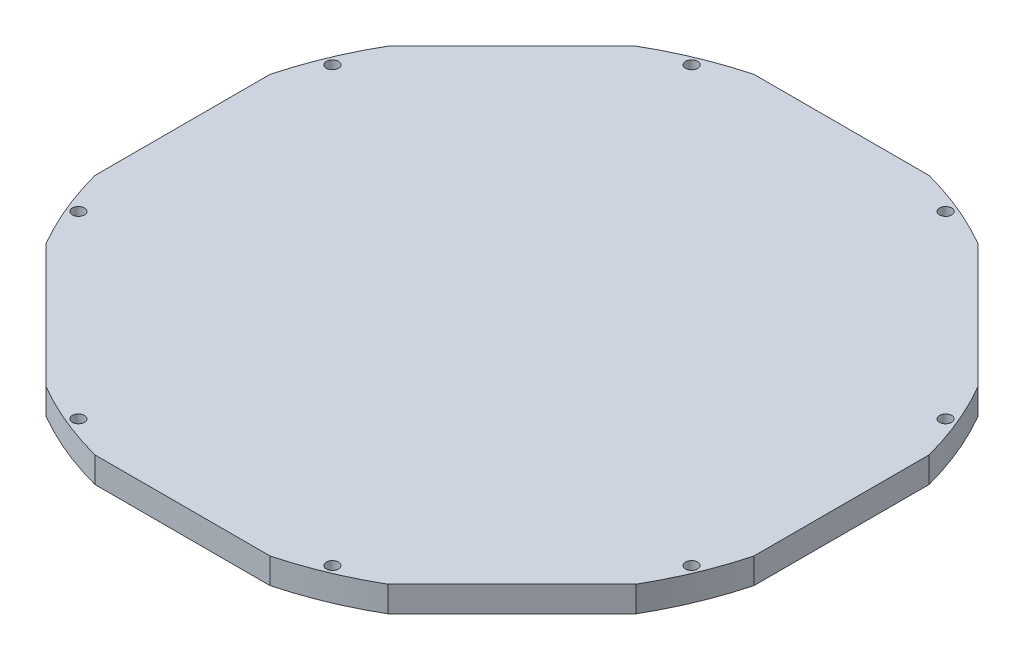
ISO-10303-21;
HEADER;
FILE_DESCRIPTION(('STEP AP214'),'2;1');
FILE_NAME('part.step','',(''),(''),'','','');
FILE_SCHEMA(('AUTOMOTIVE_DESIGN { 1 0 10303 214 1 1 1 1 }'));
ENDSEC;
DATA;
#1=APPLICATION_CONTEXT('core data for automotive mechanical design processes');
#2=APPLICATION_PROTOCOL_DEFINITION('international standard','automotive_design',2000,#1);
#3=PRODUCT_CONTEXT('',#1,'mechanical');
#4=PRODUCT('Part','Part','',(#3));
#5=PRODUCT_RELATED_PRODUCT_CATEGORY('part','',(#4));
#6=PRODUCT_DEFINITION_FORMATION('','',#4);
#7=PRODUCT_DEFINITION_CONTEXT('part definition',#1,'design');
#8=PRODUCT_DEFINITION('design','',#6,#7);
#9=PRODUCT_DEFINITION_SHAPE('','',#8);
#10=(LENGTH_UNIT() NAMED_UNIT(*) SI_UNIT(.MILLI.,.METRE.));
#11=(NAMED_UNIT(*) PLANE_ANGLE_UNIT() SI_UNIT($,.RADIAN.));
#12=(NAMED_UNIT(*) SI_UNIT($,.STERADIAN.) SOLID_ANGLE_UNIT());
#13=UNCERTAINTY_MEASURE_WITH_UNIT(LENGTH_MEASURE(1.E-05),#10,'distance_accuracy_value','');
#14=(GEOMETRIC_REPRESENTATION_CONTEXT(3) GLOBAL_UNCERTAINTY_ASSIGNED_CONTEXT((#13)) GLOBAL_UNIT_ASSIGNED_CONTEXT((#10,
#11,#12)) REPRESENTATION_CONTEXT('',''));
#15=CARTESIAN_POINT('',(0.,0.,0.));
#16=DIRECTION('',(0.,0.,1.));
#17=DIRECTION('',(1.,0.,0.));
#18=AXIS2_PLACEMENT_3D('',#15,#16,#17);
#19=CARTESIAN_POINT('',(0.,9.525,122.123199999997));
#20=DIRECTION('',(0.,0.,1.));
#21=DIRECTION('',(1.,0.,0.));
#22=AXIS2_PLACEMENT_3D('',#19,#20,#21);
#23=PLANE('',#22);
#24=DIRECTION('',(-1.,0.,0.));
#25=VECTOR('',#24,1.);
#26=CARTESIAN_POINT('',(0.,0.,122.123199999997));
#27=LINE('',#26,#25);
#28=CARTESIAN_POINT('',(32.4659397948168,0.,122.123199999997));
#29=VERTEX_POINT('',#28);
#30=CARTESIAN_POINT('',(-32.4659397947961,0.,122.123199999997));
#31=VERTEX_POINT('',#30);
#32=EDGE_CURVE('E185',#29,#31,#27,.T.);
#33=ORIENTED_EDGE('',*,*,#32,.F.);
#34=DIRECTION('',(0.,-1.,0.));
#35=VECTOR('',#34,1.);
#36=CARTESIAN_POINT('',(32.4659397948168,9.525,122.123199999997));
#37=LINE('',#36,#35);
#38=CARTESIAN_POINT('',(32.4659397948168,9.525,122.123199999997));
#39=VERTEX_POINT('',#38);
#40=EDGE_CURVE('E11',#39,#29,#37,.T.);
#41=ORIENTED_EDGE('',*,*,#40,.F.);
#42=DIRECTION('',(-1.,0.,0.));
#43=VECTOR('',#42,1.);
#44=CARTESIAN_POINT('',(0.,9.525,122.123199999997));
#45=LINE('',#44,#43);
#46=CARTESIAN_POINT('',(-32.4659397947961,9.525,122.123199999997));
#47=VERTEX_POINT('',#46);
#48=EDGE_CURVE('E299',#39,#47,#45,.T.);
#49=ORIENTED_EDGE('',*,*,#48,.T.);
#50=DIRECTION('',(0.,-1.,0.));
#51=VECTOR('',#50,1.);
#52=CARTESIAN_POINT('',(-32.4659397947961,9.525,122.123199999997));
#53=LINE('',#52,#51);
#54=EDGE_CURVE('E92',#47,#31,#53,.T.);
#55=ORIENTED_EDGE('',*,*,#54,.T.);
#56=EDGE_LOOP('',(#33,#41,#49,#55));
#57=FACE_BOUND('',#56,.T.);
#58=ADVANCED_FACE('F17',(#57),#23,.T.);
#59=CARTESIAN_POINT('',(0.,9.525,0.));
#60=DIRECTION('',(0.,-1.,0.));
#61=DIRECTION('',(0.,0.,-1.));
#62=AXIS2_PLACEMENT_3D('',#59,#60,#61);
#63=CYLINDRICAL_SURFACE('',#62,126.365);
#64=CARTESIAN_POINT('',(0.,0.,0.));
#65=DIRECTION('',(0.,1.,0.));
#66=DIRECTION('',(0.,0.,1.));
#67=AXIS2_PLACEMENT_3D('',#64,#65,#66);
#68=CIRCLE('',#67,126.365);
#69=CARTESIAN_POINT('',(63.397256673707,0.,109.311029046697));
#70=VERTEX_POINT('',#69);
#71=EDGE_CURVE('E188',#29,#70,#68,.T.);
#72=ORIENTED_EDGE('',*,*,#71,.T.);
#73=DIRECTION('',(0.,-1.,0.));
#74=VECTOR('',#73,1.);
#75=CARTESIAN_POINT('',(63.397256673707,9.525,109.311029046697));
#76=LINE('',#75,#74);
#77=CARTESIAN_POINT('',(63.397256673707,9.525,109.311029046697));
#78=VERTEX_POINT('',#77);
#79=EDGE_CURVE('E26',#78,#70,#76,.T.);
#80=ORIENTED_EDGE('',*,*,#79,.F.);
#81=CARTESIAN_POINT('',(0.,9.525,0.));
#82=DIRECTION('',(0.,1.,0.));
#83=DIRECTION('',(0.,0.,1.));
#84=AXIS2_PLACEMENT_3D('',#81,#82,#83);
#85=CIRCLE('',#84,126.365);
#86=EDGE_CURVE('E157',#39,#78,#85,.T.);
#87=ORIENTED_EDGE('',*,*,#86,.F.);
#88=ORIENTED_EDGE('',*,*,#40,.T.);
#89=EDGE_LOOP('',(#72,#80,#87,#88));
#90=FACE_BOUND('',#89,.T.);
#91=ADVANCED_FACE('F248',(#90),#63,.T.);
#92=CARTESIAN_POINT('',(86.3541428602019,9.525,86.3541428602019));
#93=DIRECTION('',(0.707106781186548,0.,0.707106781186548));
#94=DIRECTION('',(0.707106781186548,0.,-0.707106781186548));
#95=AXIS2_PLACEMENT_3D('',#92,#93,#94);
#96=PLANE('',#95);
#97=DIRECTION('',(-0.707106781186548,0.,0.707106781186548));
#98=VECTOR('',#97,1.);
#99=CARTESIAN_POINT('',(86.3541428602019,0.,86.3541428602019));
#100=LINE('',#99,#98);
#101=CARTESIAN_POINT('',(109.311029046711,0.,63.3972566736932));
#102=VERTEX_POINT('',#101);
#103=EDGE_CURVE('E191',#102,#70,#100,.T.);
#104=ORIENTED_EDGE('',*,*,#103,.F.);
#105=DIRECTION('',(0.,-1.,0.));
#106=VECTOR('',#105,1.);
#107=CARTESIAN_POINT('',(109.311029046711,9.525,63.3972566736932));
#108=LINE('',#107,#106);
#109=CARTESIAN_POINT('',(109.311029046711,9.525,63.3972566736932));
#110=VERTEX_POINT('',#109);
#111=EDGE_CURVE('E238',#110,#102,#108,.T.);
#112=ORIENTED_EDGE('',*,*,#111,.F.);
#113=DIRECTION('',(-0.707106781186548,0.,0.707106781186548));
#114=VECTOR('',#113,1.);
#115=CARTESIAN_POINT('',(86.3541428602019,9.525,86.3541428602019));
#116=LINE('',#115,#114);
#117=EDGE_CURVE('E245',#110,#78,#116,.T.);
#118=ORIENTED_EDGE('',*,*,#117,.T.);
#119=ORIENTED_EDGE('',*,*,#79,.T.);
#120=EDGE_LOOP('',(#104,#112,#118,#119));
#121=FACE_BOUND('',#120,.T.);
#122=ADVANCED_FACE('F243',(#121),#96,.T.);
#123=CARTESIAN_POINT('',(122.123200000004,0.,32.4659397948));
#124=VERTEX_POINT('',#123);
#125=EDGE_CURVE('E193',#102,#124,#68,.T.);
#126=ORIENTED_EDGE('',*,*,#125,.T.);
#127=DIRECTION('',(0.,-1.,0.));
#128=VECTOR('',#127,1.);
#129=CARTESIAN_POINT('',(122.123200000004,9.525,32.4659397948));
#130=LINE('',#129,#128);
#131=CARTESIAN_POINT('',(122.123200000004,9.525,32.4659397948));
#132=VERTEX_POINT('',#131);
#133=EDGE_CURVE('E236',#132,#124,#130,.T.);
#134=ORIENTED_EDGE('',*,*,#133,.F.);
#135=EDGE_CURVE('E301',#110,#132,#85,.T.);
#136=ORIENTED_EDGE('',*,*,#135,.F.);
#137=ORIENTED_EDGE('',*,*,#111,.T.);
#138=EDGE_LOOP('',(#126,#134,#136,#137));
#139=FACE_BOUND('',#138,.T.);
#140=ADVANCED_FACE('F325',(#139),#63,.T.);
#141=CARTESIAN_POINT('',(122.123200000004,9.525,0.));
#142=DIRECTION('',(1.,0.,0.));
#143=DIRECTION('',(0.,0.,-1.));
#144=AXIS2_PLACEMENT_3D('',#141,#142,#143);
#145=PLANE('',#144);
#146=DIRECTION('',(0.,0.,1.));
#147=VECTOR('',#146,1.);
#148=CARTESIAN_POINT('',(122.123200000004,0.,0.));
#149=LINE('',#148,#147);
#150=CARTESIAN_POINT('',(122.123200000004,0.,-32.465939794813));
#151=VERTEX_POINT('',#150);
#152=EDGE_CURVE('E196',#151,#124,#149,.T.);
#153=ORIENTED_EDGE('',*,*,#152,.F.);
#154=DIRECTION('',(0.,-1.,0.));
#155=VECTOR('',#154,1.);
#156=CARTESIAN_POINT('',(122.123200000004,9.525,-32.465939794813));
#157=LINE('',#156,#155);
#158=CARTESIAN_POINT('',(122.123200000004,9.525,-32.465939794813));
#159=VERTEX_POINT('',#158);
#160=EDGE_CURVE('E234',#159,#151,#157,.T.);
#161=ORIENTED_EDGE('',*,*,#160,.F.);
#162=DIRECTION('',(0.,0.,1.));
#163=VECTOR('',#162,1.);
#164=CARTESIAN_POINT('',(122.123200000004,9.525,0.));
#165=LINE('',#164,#163);
#166=EDGE_CURVE('E303',#159,#132,#165,.T.);
#167=ORIENTED_EDGE('',*,*,#166,.T.);
#168=ORIENTED_EDGE('',*,*,#133,.T.);
#169=EDGE_LOOP('',(#153,#161,#167,#168));
#170=FACE_BOUND('',#169,.T.);
#171=ADVANCED_FACE('F327',(#170),#145,.T.);
#172=CARTESIAN_POINT('',(109.311029046703,0.,-63.3972566737032));
#173=VERTEX_POINT('',#172);
#174=EDGE_CURVE('E199',#151,#173,#68,.T.);
#175=ORIENTED_EDGE('',*,*,#174,.T.);
#176=DIRECTION('',(0.,-1.,0.));
#177=VECTOR('',#176,1.);
#178=CARTESIAN_POINT('',(109.311029046703,9.525,-63.3972566737032));
#179=LINE('',#178,#177);
#180=CARTESIAN_POINT('',(109.311029046703,9.525,-63.3972566737032));
#181=VERTEX_POINT('',#180);
#182=EDGE_CURVE('E232',#181,#173,#179,.T.);
#183=ORIENTED_EDGE('',*,*,#182,.F.);
#184=EDGE_CURVE('E306',#159,#181,#85,.T.);
#185=ORIENTED_EDGE('',*,*,#184,.F.);
#186=ORIENTED_EDGE('',*,*,#160,.T.);
#187=EDGE_LOOP('',(#175,#183,#185,#186));
#188=FACE_BOUND('',#187,.T.);
#189=ADVANCED_FACE('F328',(#188),#63,.T.);
#190=CARTESIAN_POINT('',(86.3541428602033,9.525,-86.3541428602033));
#191=DIRECTION('',(0.707106781186548,0.,-0.707106781186548));
#192=DIRECTION('',(-0.707106781186548,0.,-0.707106781186548));
#193=AXIS2_PLACEMENT_3D('',#190,#191,#192);
#194=PLANE('',#193);
#195=DIRECTION('',(0.707106781186548,0.,0.707106781186548));
#196=VECTOR('',#195,1.);
#197=CARTESIAN_POINT('',(86.3541428602033,0.,-86.3541428602033));
#198=LINE('',#197,#196);
#199=CARTESIAN_POINT('',(63.3972566736997,0.,-109.311029046707));
#200=VERTEX_POINT('',#199);
#201=EDGE_CURVE('E200',#200,#173,#198,.T.);
#202=ORIENTED_EDGE('',*,*,#201,.F.);
#203=DIRECTION('',(0.,-1.,0.));
#204=VECTOR('',#203,1.);
#205=CARTESIAN_POINT('',(63.3972566736997,9.525,-109.311029046707));
#206=LINE('',#205,#204);
#207=CARTESIAN_POINT('',(63.3972566736997,9.525,-109.311029046707));
#208=VERTEX_POINT('',#207);
#209=EDGE_CURVE('E230',#208,#200,#206,.T.);
#210=ORIENTED_EDGE('',*,*,#209,.F.);
#211=DIRECTION('',(0.707106781186548,0.,0.707106781186548));
#212=VECTOR('',#211,1.);
#213=CARTESIAN_POINT('',(86.3541428602033,9.525,-86.3541428602033));
#214=LINE('',#213,#212);
#215=EDGE_CURVE('E307',#208,#181,#214,.T.);
#216=ORIENTED_EDGE('',*,*,#215,.T.);
#217=ORIENTED_EDGE('',*,*,#182,.T.);
#218=EDGE_LOOP('',(#202,#210,#216,#217));
#219=FACE_BOUND('',#218,.T.);
#220=ADVANCED_FACE('F331',(#219),#194,.T.);
#221=CARTESIAN_POINT('',(32.4659397948065,0.,-122.1232));
#222=VERTEX_POINT('',#221);
#223=EDGE_CURVE('E203',#200,#222,#68,.T.);
#224=ORIENTED_EDGE('',*,*,#223,.T.);
#225=DIRECTION('',(0.,-1.,0.));
#226=VECTOR('',#225,1.);
#227=CARTESIAN_POINT('',(32.4659397948065,9.525,-122.1232));
#228=LINE('',#227,#226);
#229=CARTESIAN_POINT('',(32.4659397948065,9.525,-122.1232));
#230=VERTEX_POINT('',#229);
#231=EDGE_CURVE('E228',#230,#222,#228,.T.);
#232=ORIENTED_EDGE('',*,*,#231,.F.);
#233=EDGE_CURVE('E310',#208,#230,#85,.T.);
#234=ORIENTED_EDGE('',*,*,#233,.F.);
#235=ORIENTED_EDGE('',*,*,#209,.T.);
#236=EDGE_LOOP('',(#224,#232,#234,#235));
#237=FACE_BOUND('',#236,.T.);
#238=ADVANCED_FACE('F332',(#237),#63,.T.);
#239=CARTESIAN_POINT('',(0.,9.525,-122.1232));
#240=DIRECTION('',(0.,0.,-1.));
#241=DIRECTION('',(-1.,0.,0.));
#242=AXIS2_PLACEMENT_3D('',#239,#240,#241);
#243=PLANE('',#242);
#244=DIRECTION('',(1.,0.,0.));
#245=VECTOR('',#244,1.);
#246=CARTESIAN_POINT('',(0.,0.,-122.1232));
#247=LINE('',#246,#245);
#248=CARTESIAN_POINT('',(-32.4659397948065,0.,-122.1232));
#249=VERTEX_POINT('',#248);
#250=EDGE_CURVE('E204',#249,#222,#247,.T.);
#251=ORIENTED_EDGE('',*,*,#250,.F.);
#252=DIRECTION('',(0.,-1.,0.));
#253=VECTOR('',#252,1.);
#254=CARTESIAN_POINT('',(-32.4659397948065,9.525,-122.1232));
#255=LINE('',#254,#253);
#256=CARTESIAN_POINT('',(-32.4659397948065,9.525,-122.1232));
#257=VERTEX_POINT('',#256);
#258=EDGE_CURVE('E226',#257,#249,#255,.T.);
#259=ORIENTED_EDGE('',*,*,#258,.F.);
#260=DIRECTION('',(1.,0.,0.));
#261=VECTOR('',#260,1.);
#262=CARTESIAN_POINT('',(0.,9.525,-122.1232));
#263=LINE('',#262,#261);
#264=EDGE_CURVE('E311',#257,#230,#263,.T.);
#265=ORIENTED_EDGE('',*,*,#264,.T.);
#266=ORIENTED_EDGE('',*,*,#231,.T.);
#267=EDGE_LOOP('',(#251,#259,#265,#266));
#268=FACE_BOUND('',#267,.T.);
#269=ADVANCED_FACE('F335',(#268),#243,.T.);
#270=CARTESIAN_POINT('',(-63.3972566736967,0.,-109.311029046699));
#271=VERTEX_POINT('',#270);
#272=EDGE_CURVE('E207',#249,#271,#68,.T.);
#273=ORIENTED_EDGE('',*,*,#272,.T.);
#274=DIRECTION('',(0.,-1.,0.));
#275=VECTOR('',#274,1.);
#276=CARTESIAN_POINT('',(-63.3972566736967,9.525,-109.311029046699));
#277=LINE('',#276,#275);
#278=CARTESIAN_POINT('',(-63.3972566736967,9.525,-109.311029046699));
#279=VERTEX_POINT('',#278);
#280=EDGE_CURVE('E224',#279,#271,#277,.T.);
#281=ORIENTED_EDGE('',*,*,#280,.F.);
#282=EDGE_CURVE('E313',#257,#279,#85,.T.);
#283=ORIENTED_EDGE('',*,*,#282,.F.);
#284=ORIENTED_EDGE('',*,*,#258,.T.);
#285=EDGE_LOOP('',(#273,#281,#283,#284));
#286=FACE_BOUND('',#285,.T.);
#287=ADVANCED_FACE('F336',(#286),#63,.T.);
#288=CARTESIAN_POINT('',(-86.3541428601982,9.525,-86.3541428601981));
#289=DIRECTION('',(-0.707106781186548,0.,-0.707106781186547));
#290=DIRECTION('',(-0.707106781186547,0.,0.707106781186548));
#291=AXIS2_PLACEMENT_3D('',#288,#289,#290);
#292=PLANE('',#291);
#293=DIRECTION('',(0.707106781186547,0.,-0.707106781186548));
#294=VECTOR('',#293,1.);
#295=CARTESIAN_POINT('',(-86.3541428601982,0.,-86.3541428601981));
#296=LINE('',#295,#294);
#297=CARTESIAN_POINT('',(-109.3110290467,0.,-63.3972566736959));
#298=VERTEX_POINT('',#297);
#299=EDGE_CURVE('E208',#298,#271,#296,.T.);
#300=ORIENTED_EDGE('',*,*,#299,.F.);
#301=DIRECTION('',(0.,-1.,0.));
#302=VECTOR('',#301,1.);
#303=CARTESIAN_POINT('',(-109.3110290467,9.525,-63.3972566736959));
#304=LINE('',#303,#302);
#305=CARTESIAN_POINT('',(-109.3110290467,9.525,-63.3972566736959));
#306=VERTEX_POINT('',#305);
#307=EDGE_CURVE('E222',#306,#298,#304,.T.);
#308=ORIENTED_EDGE('',*,*,#307,.F.);
#309=DIRECTION('',(0.707106781186547,0.,-0.707106781186548));
#310=VECTOR('',#309,1.);
#311=CARTESIAN_POINT('',(-86.3541428601982,9.525,-86.3541428601981));
#312=LINE('',#311,#310);
#313=EDGE_CURVE('E314',#306,#279,#312,.T.);
#314=ORIENTED_EDGE('',*,*,#313,.T.);
#315=ORIENTED_EDGE('',*,*,#280,.T.);
#316=EDGE_LOOP('',(#300,#308,#314,#315));
#317=FACE_BOUND('',#316,.T.);
#318=ADVANCED_FACE('F338',(#317),#292,.T.);
#319=CARTESIAN_POINT('',(-122.123199999993,0.,-32.4659397948027));
#320=VERTEX_POINT('',#319);
#321=EDGE_CURVE('E211',#298,#320,#68,.T.);
#322=ORIENTED_EDGE('',*,*,#321,.T.);
#323=DIRECTION('',(0.,-1.,0.));
#324=VECTOR('',#323,1.);
#325=CARTESIAN_POINT('',(-122.123199999993,9.525,-32.4659397948027));
#326=LINE('',#325,#324);
#327=CARTESIAN_POINT('',(-122.123199999993,9.525,-32.4659397948027));
#328=VERTEX_POINT('',#327);
#329=EDGE_CURVE('E220',#328,#320,#326,.T.);
#330=ORIENTED_EDGE('',*,*,#329,.F.);
#331=EDGE_CURVE('E144',#306,#328,#85,.T.);
#332=ORIENTED_EDGE('',*,*,#331,.F.);
#333=ORIENTED_EDGE('',*,*,#307,.T.);
#334=EDGE_LOOP('',(#322,#330,#332,#333));
#335=FACE_BOUND('',#334,.T.);
#336=ADVANCED_FACE('F343',(#335),#63,.T.);
#337=CARTESIAN_POINT('',(-122.123199999993,9.525,0.));
#338=DIRECTION('',(-1.,0.,0.));
#339=DIRECTION('',(0.,0.,1.));
#340=AXIS2_PLACEMENT_3D('',#337,#338,#339);
#341=PLANE('',#340);
#342=DIRECTION('',(0.,0.,-1.));
#343=VECTOR('',#342,1.);
#344=CARTESIAN_POINT('',(-122.123199999993,0.,0.));
#345=LINE('',#344,#343);
#346=CARTESIAN_POINT('',(-122.123199999993,0.,32.4659397948103));
#347=VERTEX_POINT('',#346);
#348=EDGE_CURVE('E212',#347,#320,#345,.T.);
#349=ORIENTED_EDGE('',*,*,#348,.F.);
#350=DIRECTION('',(0.,-1.,0.));
#351=VECTOR('',#350,1.);
#352=CARTESIAN_POINT('',(-122.123199999993,9.525,32.4659397948103));
#353=LINE('',#352,#351);
#354=CARTESIAN_POINT('',(-122.123199999993,9.525,32.4659397948103));
#355=VERTEX_POINT('',#354);
#356=EDGE_CURVE('E153',#355,#347,#353,.T.);
#357=ORIENTED_EDGE('',*,*,#356,.F.);
#358=DIRECTION('',(0.,0.,-1.));
#359=VECTOR('',#358,1.);
#360=CARTESIAN_POINT('',(-122.123199999993,9.525,0.));
#361=LINE('',#360,#359);
#362=EDGE_CURVE('E141',#355,#328,#361,.T.);
#363=ORIENTED_EDGE('',*,*,#362,.T.);
#364=ORIENTED_EDGE('',*,*,#329,.T.);
#365=EDGE_LOOP('',(#349,#357,#363,#364));
#366=FACE_BOUND('',#365,.T.);
#367=ADVANCED_FACE('F342',(#366),#341,.T.);
#368=CARTESIAN_POINT('',(-109.311029046693,0.,63.3972566737005));
#369=VERTEX_POINT('',#368);
#370=EDGE_CURVE('E149',#347,#369,#68,.T.);
#371=ORIENTED_EDGE('',*,*,#370,.T.);
#372=DIRECTION('',(0.,-1.,0.));
#373=VECTOR('',#372,1.);
#374=CARTESIAN_POINT('',(-109.311029046693,9.525,63.3972566737005));
#375=LINE('',#374,#373);
#376=CARTESIAN_POINT('',(-109.311029046693,9.525,63.3972566737005));
#377=VERTEX_POINT('',#376);
#378=EDGE_CURVE('E146',#377,#369,#375,.T.);
#379=ORIENTED_EDGE('',*,*,#378,.F.);
#380=EDGE_CURVE('E135',#355,#377,#85,.T.);
#381=ORIENTED_EDGE('',*,*,#380,.F.);
#382=ORIENTED_EDGE('',*,*,#356,.T.);
#383=EDGE_LOOP('',(#371,#379,#381,#382));
#384=FACE_BOUND('',#383,.T.);
#385=ADVANCED_FACE('F147',(#384),#63,.T.);
#386=CARTESIAN_POINT('',(-86.3541428601968,9.525,86.3541428601968));
#387=DIRECTION('',(-0.707106781186547,0.,0.707106781186548));
#388=DIRECTION('',(0.707106781186548,0.,0.707106781186547));
#389=AXIS2_PLACEMENT_3D('',#386,#387,#388);
#390=PLANE('',#389);
#391=DIRECTION('',(-0.707106781186548,0.,-0.707106781186547));
#392=VECTOR('',#391,1.);
#393=CARTESIAN_POINT('',(-86.3541428601968,0.,86.3541428601968));
#394=LINE('',#393,#392);
#395=CARTESIAN_POINT('',(-63.3972566736894,0.,109.311029046704));
#396=VERTEX_POINT('',#395);
#397=EDGE_CURVE('E215',#396,#369,#394,.T.);
#398=ORIENTED_EDGE('',*,*,#397,.F.);
#399=DIRECTION('',(0.,-1.,0.));
#400=VECTOR('',#399,1.);
#401=CARTESIAN_POINT('',(-63.3972566736894,9.525,109.311029046704));
#402=LINE('',#401,#400);
#403=CARTESIAN_POINT('',(-63.3972566736894,9.525,109.311029046704));
#404=VERTEX_POINT('',#403);
#405=EDGE_CURVE('E85',#404,#396,#402,.T.);
#406=ORIENTED_EDGE('',*,*,#405,.F.);
#407=DIRECTION('',(-0.707106781186548,0.,-0.707106781186547));
#408=VECTOR('',#407,1.);
#409=CARTESIAN_POINT('',(-86.3541428601968,9.525,86.3541428601968));
#410=LINE('',#409,#408);
#411=EDGE_CURVE('E139',#404,#377,#410,.T.);
#412=ORIENTED_EDGE('',*,*,#411,.T.);
#413=ORIENTED_EDGE('',*,*,#378,.T.);
#414=EDGE_LOOP('',(#398,#406,#412,#413));
#415=FACE_BOUND('',#414,.T.);
#416=ADVANCED_FACE('F155',(#415),#390,.T.);
#417=CARTESIAN_POINT('',(-47.0662,9.525,-113.6396));
#418=DIRECTION('',(0.,-1.,0.));
#419=DIRECTION('',(0.,0.,-1.));
#420=AXIS2_PLACEMENT_3D('',#417,#418,#419);
#421=CYLINDRICAL_SURFACE('',#420,2.2479);
#422=CARTESIAN_POINT('',(-47.0662,9.525,-113.6396));
#423=DIRECTION('',(0.,1.,0.));
#424=DIRECTION('',(0.,0.,1.));
#425=AXIS2_PLACEMENT_3D('',#422,#423,#424);
#426=CIRCLE('',#425,2.2479);
#427=CARTESIAN_POINT('',(-47.0662,9.525,-111.3917));
#428=VERTEX_POINT('',#427);
#429=EDGE_CURVE('E296',#428,#428,#426,.T.);
#430=ORIENTED_EDGE('',*,*,#429,.T.);
#431=EDGE_LOOP('',(#430));
#432=FACE_BOUND('',#431,.T.);
#433=CARTESIAN_POINT('',(-47.0662,0.,-113.6396));
#434=DIRECTION('',(0.,1.,0.));
#435=DIRECTION('',(0.,0.,1.));
#436=AXIS2_PLACEMENT_3D('',#433,#434,#435);
#437=CIRCLE('',#436,2.2479);
#438=CARTESIAN_POINT('',(-47.0662,0.,-111.3917));
#439=VERTEX_POINT('',#438);
#440=EDGE_CURVE('E182',#439,#439,#437,.T.);
#441=ORIENTED_EDGE('',*,*,#440,.F.);
#442=EDGE_LOOP('',(#441));
#443=FACE_BOUND('',#442,.T.);
#444=ADVANCED_FACE('F368',(#432,#443),#421,.F.);
#445=CARTESIAN_POINT('',(47.0745025866445,9.525,-113.636160956013));
#446=DIRECTION('',(0.,-1.,0.));
#447=DIRECTION('',(0.,0.,-1.));
#448=AXIS2_PLACEMENT_3D('',#445,#446,#447);
#449=CYLINDRICAL_SURFACE('',#448,2.2479000000021);
#450=CARTESIAN_POINT('',(47.0745025866445,9.525,-113.636160956013));
#451=DIRECTION('',(0.,1.,0.));
#452=DIRECTION('',(0.,0.,1.));
#453=AXIS2_PLACEMENT_3D('',#450,#451,#452);
#454=CIRCLE('',#453,2.2479000000021);
#455=CARTESIAN_POINT('',(47.0745025866445,9.525,-111.388260956011));
#456=VERTEX_POINT('',#455);
#457=EDGE_CURVE('E293',#456,#456,#454,.T.);
#458=ORIENTED_EDGE('',*,*,#457,.T.);
#459=EDGE_LOOP('',(#458));
#460=FACE_BOUND('',#459,.T.);
#461=CARTESIAN_POINT('',(47.0745025866445,0.,-113.636160956013));
#462=DIRECTION('',(0.,1.,0.));
#463=DIRECTION('',(0.,0.,1.));
#464=AXIS2_PLACEMENT_3D('',#461,#462,#463);
#465=CIRCLE('',#464,2.2479000000021);
#466=CARTESIAN_POINT('',(47.0745025866445,0.,-111.388260956011));
#467=VERTEX_POINT('',#466);
#468=EDGE_CURVE('E179',#467,#467,#465,.T.);
#469=ORIENTED_EDGE('',*,*,#468,.F.);
#470=EDGE_LOOP('',(#469));
#471=FACE_BOUND('',#470,.T.);
#472=ADVANCED_FACE('F371',(#460,#471),#449,.F.);
#473=CARTESIAN_POINT('',(113.639600000003,9.525,-47.0662000000068));
#474=DIRECTION('',(0.,-1.,0.));
#475=DIRECTION('',(0.,0.,-1.));
#476=AXIS2_PLACEMENT_3D('',#473,#474,#475);
#477=CYLINDRICAL_SURFACE('',#476,2.24790000000612);
#478=CARTESIAN_POINT('',(113.639600000003,9.525,-47.0662000000068));
#479=DIRECTION('',(0.,1.,0.));
#480=DIRECTION('',(0.,0.,1.));
#481=AXIS2_PLACEMENT_3D('',#478,#479,#480);
#482=CIRCLE('',#481,2.24790000000612);
#483=CARTESIAN_POINT('',(113.639600000003,9.525,-44.8183000000007));
#484=VERTEX_POINT('',#483);
#485=EDGE_CURVE('E290',#484,#484,#482,.T.);
#486=ORIENTED_EDGE('',*,*,#485,.T.);
#487=EDGE_LOOP('',(#486));
#488=FACE_BOUND('',#487,.T.);
#489=CARTESIAN_POINT('',(113.639600000003,0.,-47.0662000000068));
#490=DIRECTION('',(0.,1.,0.));
#491=DIRECTION('',(0.,0.,1.));
#492=AXIS2_PLACEMENT_3D('',#489,#490,#491);
#493=CIRCLE('',#492,2.24790000000612);
#494=CARTESIAN_POINT('',(113.639600000003,0.,-44.8183000000007));
#495=VERTEX_POINT('',#494);
#496=EDGE_CURVE('E176',#495,#495,#493,.T.);
#497=ORIENTED_EDGE('',*,*,#496,.F.);
#498=EDGE_LOOP('',(#497));
#499=FACE_BOUND('',#498,.T.);
#500=ADVANCED_FACE('F375',(#488,#499),#477,.F.);
#501=CARTESIAN_POINT('',(113.636160956016,9.525,47.0745025866377));
#502=DIRECTION('',(0.,-1.,0.));
#503=DIRECTION('',(0.,0.,-1.));
#504=AXIS2_PLACEMENT_3D('',#501,#502,#503);
#505=CYLINDRICAL_SURFACE('',#504,2.24790000000987);
#506=CARTESIAN_POINT('',(113.636160956016,9.525,47.0745025866377));
#507=DIRECTION('',(0.,1.,0.));
#508=DIRECTION('',(0.,0.,1.));
#509=AXIS2_PLACEMENT_3D('',#506,#507,#508);
#510=CIRCLE('',#509,2.24790000000987);
#511=CARTESIAN_POINT('',(113.636160956016,9.525,49.3224025866476));
#512=VERTEX_POINT('',#511);
#513=EDGE_CURVE('E287',#512,#512,#510,.T.);
#514=ORIENTED_EDGE('',*,*,#513,.T.);
#515=EDGE_LOOP('',(#514));
#516=FACE_BOUND('',#515,.T.);
#517=CARTESIAN_POINT('',(113.636160956016,0.,47.0745025866377));
#518=DIRECTION('',(0.,1.,0.));
#519=DIRECTION('',(0.,0.,1.));
#520=AXIS2_PLACEMENT_3D('',#517,#518,#519);
#521=CIRCLE('',#520,2.24790000000987);
#522=CARTESIAN_POINT('',(113.636160956016,0.,49.3224025866476));
#523=VERTEX_POINT('',#522);
#524=EDGE_CURVE('E173',#523,#523,#521,.T.);
#525=ORIENTED_EDGE('',*,*,#524,.F.);
#526=EDGE_LOOP('',(#525));
#527=FACE_BOUND('',#526,.T.);
#528=ADVANCED_FACE('F379',(#516,#527),#505,.F.);
#529=CARTESIAN_POINT('',(47.0662000000096,9.525,113.639599999996));
#530=DIRECTION('',(0.,-1.,0.));
#531=DIRECTION('',(0.,0.,-1.));
#532=AXIS2_PLACEMENT_3D('',#529,#530,#531);
#533=CYLINDRICAL_SURFACE('',#532,2.24790000001124);
#534=CARTESIAN_POINT('',(47.0662000000096,9.525,113.639599999996));
#535=DIRECTION('',(0.,1.,0.));
#536=DIRECTION('',(0.,0.,1.));
#537=AXIS2_PLACEMENT_3D('',#534,#535,#536);
#538=CIRCLE('',#537,2.24790000001124);
#539=CARTESIAN_POINT('',(47.0662000000096,9.525,115.887500000007));
#540=VERTEX_POINT('',#539);
#541=EDGE_CURVE('E284',#540,#540,#538,.T.);
#542=ORIENTED_EDGE('',*,*,#541,.T.);
#543=EDGE_LOOP('',(#542));
#544=FACE_BOUND('',#543,.T.);
#545=CARTESIAN_POINT('',(47.0662000000096,0.,113.639599999996));
#546=DIRECTION('',(0.,1.,0.));
#547=DIRECTION('',(0.,0.,1.));
#548=AXIS2_PLACEMENT_3D('',#545,#546,#547);
#549=CIRCLE('',#548,2.24790000001124);
#550=CARTESIAN_POINT('',(47.0662000000096,0.,115.887500000007));
#551=VERTEX_POINT('',#550);
#552=EDGE_CURVE('E170',#551,#551,#549,.T.);
#553=ORIENTED_EDGE('',*,*,#552,.F.);
#554=EDGE_LOOP('',(#553));
#555=FACE_BOUND('',#554,.T.);
#556=ADVANCED_FACE('F383',(#544,#555),#533,.F.);
#557=CARTESIAN_POINT('',(-47.0745025866349,9.525,113.636160956009));
#558=DIRECTION('',(0.,-1.,0.));
#559=DIRECTION('',(0.,0.,-1.));
#560=AXIS2_PLACEMENT_3D('',#557,#558,#559);
#561=CYLINDRICAL_SURFACE('',#560,2.24790000000961);
#562=CARTESIAN_POINT('',(-47.0745025866349,9.525,113.636160956009));
#563=DIRECTION('',(0.,1.,0.));
#564=DIRECTION('',(0.,0.,1.));
#565=AXIS2_PLACEMENT_3D('',#562,#563,#564);
#566=CIRCLE('',#565,2.24790000000961);
#567=CARTESIAN_POINT('',(-47.0745025866349,9.525,115.884060956019));
#568=VERTEX_POINT('',#567);
#569=EDGE_CURVE('E279',#568,#568,#566,.T.);
#570=ORIENTED_EDGE('',*,*,#569,.T.);
#571=EDGE_LOOP('',(#570));
#572=FACE_BOUND('',#571,.T.);
#573=CARTESIAN_POINT('',(-47.0745025866349,0.,113.636160956009));
#574=DIRECTION('',(0.,1.,0.));
#575=DIRECTION('',(0.,0.,1.));
#576=AXIS2_PLACEMENT_3D('',#573,#574,#575);
#577=CIRCLE('',#576,2.24790000000961);
#578=CARTESIAN_POINT('',(-47.0745025866349,0.,115.884060956019));
#579=VERTEX_POINT('',#578);
#580=EDGE_CURVE('E167',#579,#579,#577,.T.);
#581=ORIENTED_EDGE('',*,*,#580,.F.);
#582=EDGE_LOOP('',(#581));
#583=FACE_BOUND('',#582,.T.);
#584=ADVANCED_FACE('F387',(#572,#583),#561,.F.);
#585=CARTESIAN_POINT('',(-113.639599999993,9.525,47.0662000000028));
#586=DIRECTION('',(0.,-1.,0.));
#587=DIRECTION('',(0.,0.,-1.));
#588=AXIS2_PLACEMENT_3D('',#585,#586,#587);
#589=CYLINDRICAL_SURFACE('',#588,2.247900000006);
#590=CARTESIAN_POINT('',(-113.639599999993,9.525,47.0662000000028));
#591=DIRECTION('',(0.,1.,0.));
#592=DIRECTION('',(0.,0.,1.));
#593=AXIS2_PLACEMENT_3D('',#590,#591,#592);
#594=CIRCLE('',#593,2.247900000006);
#595=CARTESIAN_POINT('',(-113.639599999993,9.525,49.3141000000088));
#596=VERTEX_POINT('',#595);
#597=EDGE_CURVE('E274',#596,#596,#594,.T.);
#598=ORIENTED_EDGE('',*,*,#597,.T.);
#599=EDGE_LOOP('',(#598));
#600=FACE_BOUND('',#599,.T.);
#601=CARTESIAN_POINT('',(-113.639599999993,0.,47.0662000000028));
#602=DIRECTION('',(0.,1.,0.));
#603=DIRECTION('',(0.,0.,1.));
#604=AXIS2_PLACEMENT_3D('',#601,#602,#603);
#605=CIRCLE('',#604,2.247900000006);
#606=CARTESIAN_POINT('',(-113.639599999993,0.,49.3141000000088));
#607=VERTEX_POINT('',#606);
#608=EDGE_CURVE('E164',#607,#607,#605,.T.);
#609=ORIENTED_EDGE('',*,*,#608,.F.);
#610=EDGE_LOOP('',(#609));
#611=FACE_BOUND('',#610,.T.);
#612=ADVANCED_FACE('F390',(#600,#611),#589,.F.);
#613=CARTESIAN_POINT('',(-113.636160956006,9.525,-47.0745025866417));
#614=DIRECTION('',(0.,-1.,0.));
#615=DIRECTION('',(0.,0.,-1.));
#616=AXIS2_PLACEMENT_3D('',#613,#614,#615);
#617=CYLINDRICAL_SURFACE('',#616,2.24790000000269);
#618=CARTESIAN_POINT('',(-113.636160956006,9.525,-47.0745025866417));
#619=DIRECTION('',(0.,1.,0.));
#620=DIRECTION('',(0.,0.,1.));
#621=AXIS2_PLACEMENT_3D('',#618,#619,#620);
#622=CIRCLE('',#621,2.24790000000269);
#623=CARTESIAN_POINT('',(-113.636160956006,9.525,-44.826602586639));
#624=VERTEX_POINT('',#623);
#625=EDGE_CURVE('E272',#624,#624,#622,.T.);
#626=ORIENTED_EDGE('',*,*,#625,.T.);
#627=EDGE_LOOP('',(#626));
#628=FACE_BOUND('',#627,.T.);
#629=CARTESIAN_POINT('',(-113.636160956006,0.,-47.0745025866417));
#630=DIRECTION('',(0.,1.,0.));
#631=DIRECTION('',(0.,0.,1.));
#632=AXIS2_PLACEMENT_3D('',#629,#630,#631);
#633=CIRCLE('',#632,2.24790000000269);
#634=CARTESIAN_POINT('',(-113.636160956006,0.,-44.826602586639));
#635=VERTEX_POINT('',#634);
#636=EDGE_CURVE('E161',#635,#635,#633,.T.);
#637=ORIENTED_EDGE('',*,*,#636,.F.);
#638=EDGE_LOOP('',(#637));
#639=FACE_BOUND('',#638,.T.);
#640=ADVANCED_FACE('F19',(#628,#639),#617,.F.);
#641=EDGE_CURVE('E192',#396,#31,#68,.T.);
#642=ORIENTED_EDGE('',*,*,#641,.T.);
#643=ORIENTED_EDGE('',*,*,#54,.F.);
#644=EDGE_CURVE('E34',#404,#47,#85,.T.);
#645=ORIENTED_EDGE('',*,*,#644,.F.);
#646=ORIENTED_EDGE('',*,*,#405,.T.);
#647=EDGE_LOOP('',(#642,#643,#645,#646));
#648=FACE_BOUND('',#647,.T.);
#649=ADVANCED_FACE('F354',(#648),#63,.T.);
#650=CARTESIAN_POINT('',(0.,9.525,0.));
#651=DIRECTION('',(0.,1.,0.));
#652=DIRECTION('',(0.,0.,1.));
#653=AXIS2_PLACEMENT_3D('',#650,#651,#652);
#654=PLANE('',#653);
#655=ORIENTED_EDGE('',*,*,#625,.F.);
#656=EDGE_LOOP('',(#655));
#657=FACE_BOUND('',#656,.T.);
#658=ORIENTED_EDGE('',*,*,#597,.F.);
#659=EDGE_LOOP('',(#658));
#660=FACE_BOUND('',#659,.T.);
#661=ORIENTED_EDGE('',*,*,#569,.F.);
#662=EDGE_LOOP('',(#661));
#663=FACE_BOUND('',#662,.T.);
#664=ORIENTED_EDGE('',*,*,#541,.F.);
#665=EDGE_LOOP('',(#664));
#666=FACE_BOUND('',#665,.T.);
#667=ORIENTED_EDGE('',*,*,#513,.F.);
#668=EDGE_LOOP('',(#667));
#669=FACE_BOUND('',#668,.T.);
#670=ORIENTED_EDGE('',*,*,#485,.F.);
#671=EDGE_LOOP('',(#670));
#672=FACE_BOUND('',#671,.T.);
#673=ORIENTED_EDGE('',*,*,#457,.F.);
#674=EDGE_LOOP('',(#673));
#675=FACE_BOUND('',#674,.T.);
#676=ORIENTED_EDGE('',*,*,#429,.F.);
#677=EDGE_LOOP('',(#676));
#678=FACE_BOUND('',#677,.T.);
#679=ORIENTED_EDGE('',*,*,#48,.F.);
#680=ORIENTED_EDGE('',*,*,#86,.T.);
#681=ORIENTED_EDGE('',*,*,#117,.F.);
#682=ORIENTED_EDGE('',*,*,#135,.T.);
#683=ORIENTED_EDGE('',*,*,#166,.F.);
#684=ORIENTED_EDGE('',*,*,#184,.T.);
#685=ORIENTED_EDGE('',*,*,#215,.F.);
#686=ORIENTED_EDGE('',*,*,#233,.T.);
#687=ORIENTED_EDGE('',*,*,#264,.F.);
#688=ORIENTED_EDGE('',*,*,#282,.T.);
#689=ORIENTED_EDGE('',*,*,#313,.F.);
#690=ORIENTED_EDGE('',*,*,#331,.T.);
#691=ORIENTED_EDGE('',*,*,#362,.F.);
#692=ORIENTED_EDGE('',*,*,#380,.T.);
#693=ORIENTED_EDGE('',*,*,#411,.F.);
#694=ORIENTED_EDGE('',*,*,#644,.T.);
#695=EDGE_LOOP('',(#679,#680,#681,#682,#683,#684,#685,#686,#687,#688,#689,#690,#691,#692,#693,#694));
#696=FACE_BOUND('',#695,.T.);
#697=ADVANCED_FACE('F137',(#657,#660,#663,#666,#669,#672,#675,#678,#696),#654,.T.);
#698=CARTESIAN_POINT('',(0.,0.,0.));
#699=DIRECTION('',(0.,1.,0.));
#700=DIRECTION('',(0.,0.,1.));
#701=AXIS2_PLACEMENT_3D('',#698,#699,#700);
#702=PLANE('',#701);
#703=ORIENTED_EDGE('',*,*,#636,.T.);
#704=EDGE_LOOP('',(#703));
#705=FACE_BOUND('',#704,.T.);
#706=ORIENTED_EDGE('',*,*,#608,.T.);
#707=EDGE_LOOP('',(#706));
#708=FACE_BOUND('',#707,.T.);
#709=ORIENTED_EDGE('',*,*,#580,.T.);
#710=EDGE_LOOP('',(#709));
#711=FACE_BOUND('',#710,.T.);
#712=ORIENTED_EDGE('',*,*,#552,.T.);
#713=EDGE_LOOP('',(#712));
#714=FACE_BOUND('',#713,.T.);
#715=ORIENTED_EDGE('',*,*,#524,.T.);
#716=EDGE_LOOP('',(#715));
#717=FACE_BOUND('',#716,.T.);
#718=ORIENTED_EDGE('',*,*,#496,.T.);
#719=EDGE_LOOP('',(#718));
#720=FACE_BOUND('',#719,.T.);
#721=ORIENTED_EDGE('',*,*,#468,.T.);
#722=EDGE_LOOP('',(#721));
#723=FACE_BOUND('',#722,.T.);
#724=ORIENTED_EDGE('',*,*,#440,.T.);
#725=EDGE_LOOP('',(#724));
#726=FACE_BOUND('',#725,.T.);
#727=ORIENTED_EDGE('',*,*,#32,.T.);
#728=ORIENTED_EDGE('',*,*,#641,.F.);
#729=ORIENTED_EDGE('',*,*,#397,.T.);
#730=ORIENTED_EDGE('',*,*,#370,.F.);
#731=ORIENTED_EDGE('',*,*,#348,.T.);
#732=ORIENTED_EDGE('',*,*,#321,.F.);
#733=ORIENTED_EDGE('',*,*,#299,.T.);
#734=ORIENTED_EDGE('',*,*,#272,.F.);
#735=ORIENTED_EDGE('',*,*,#250,.T.);
#736=ORIENTED_EDGE('',*,*,#223,.F.);
#737=ORIENTED_EDGE('',*,*,#201,.T.);
#738=ORIENTED_EDGE('',*,*,#174,.F.);
#739=ORIENTED_EDGE('',*,*,#152,.T.);
#740=ORIENTED_EDGE('',*,*,#125,.F.);
#741=ORIENTED_EDGE('',*,*,#103,.T.);
#742=ORIENTED_EDGE('',*,*,#71,.F.);
#743=EDGE_LOOP('',(#727,#728,#729,#730,#731,#732,#733,#734,#735,#736,#737,#738,#739,#740,#741,#742));
#744=FACE_BOUND('',#743,.T.);
#745=ADVANCED_FACE('F251',(#705,#708,#711,#714,#717,#720,#723,#726,#744),#702,.F.);
#746=CLOSED_SHELL('',(#58,#91,#122,#140,#171,#189,#220,#238,#269,#287,#318,#336,#367,#385,#416,
#444,#472,#500,#528,#556,#584,#612,#640,#649,#697,#745));
#747=MANIFOLD_SOLID_BREP('B1',#746);
#748=ADVANCED_BREP_SHAPE_REPRESENTATION('',(#18,#747),#14);
#749=SHAPE_DEFINITION_REPRESENTATION(#9,#748);
ENDSEC;
END-ISO-10303-21;
